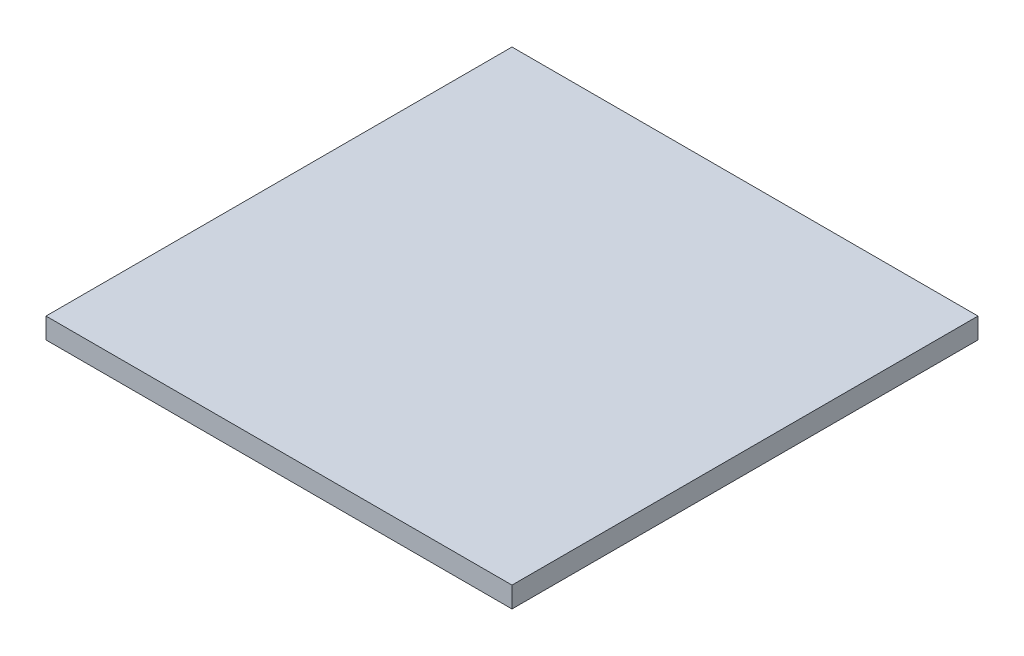
ISO-10303-21;
HEADER;
FILE_DESCRIPTION(('STEP AP214'),'2;1');
FILE_NAME('part.step','',(''),(''),'','','');
FILE_SCHEMA(('AUTOMOTIVE_DESIGN { 1 0 10303 214 1 1 1 1 }'));
ENDSEC;
DATA;
#1=APPLICATION_CONTEXT('core data for automotive mechanical design processes');
#2=APPLICATION_PROTOCOL_DEFINITION('international standard','automotive_design',2000,#1);
#3=PRODUCT_CONTEXT('',#1,'mechanical');
#4=PRODUCT('Part','Part','',(#3));
#5=PRODUCT_RELATED_PRODUCT_CATEGORY('part','',(#4));
#6=PRODUCT_DEFINITION_FORMATION('','',#4);
#7=PRODUCT_DEFINITION_CONTEXT('part definition',#1,'design');
#8=PRODUCT_DEFINITION('design','',#6,#7);
#9=PRODUCT_DEFINITION_SHAPE('','',#8);
#10=(LENGTH_UNIT() NAMED_UNIT(*) SI_UNIT(.MILLI.,.METRE.));
#11=(NAMED_UNIT(*) PLANE_ANGLE_UNIT() SI_UNIT($,.RADIAN.));
#12=(NAMED_UNIT(*) SI_UNIT($,.STERADIAN.) SOLID_ANGLE_UNIT());
#13=UNCERTAINTY_MEASURE_WITH_UNIT(LENGTH_MEASURE(1.E-05),#10,'distance_accuracy_value','');
#14=(GEOMETRIC_REPRESENTATION_CONTEXT(3) GLOBAL_UNCERTAINTY_ASSIGNED_CONTEXT((#13)) GLOBAL_UNIT_ASSIGNED_CONTEXT((#10,
#11,#12)) REPRESENTATION_CONTEXT('',''));
#15=CARTESIAN_POINT('',(0.,0.,0.));
#16=DIRECTION('',(0.,0.,1.));
#17=DIRECTION('',(1.,0.,0.));
#18=AXIS2_PLACEMENT_3D('',#15,#16,#17);
#19=CARTESIAN_POINT('',(0.,25.4,0.));
#20=DIRECTION('',(-1.,0.,0.));
#21=DIRECTION('',(0.,0.,1.));
#22=AXIS2_PLACEMENT_3D('',#19,#20,#21);
#23=PLANE('',#22);
#24=DIRECTION('',(0.,0.,-1.));
#25=VECTOR('',#24,1.);
#26=CARTESIAN_POINT('',(0.,0.,0.));
#27=LINE('',#26,#25);
#28=CARTESIAN_POINT('',(0.,0.,0.));
#29=VERTEX_POINT('',#28);
#30=CARTESIAN_POINT('',(0.,0.,-571.5));
#31=VERTEX_POINT('',#30);
#32=EDGE_CURVE('E96',#29,#31,#27,.T.);
#33=ORIENTED_EDGE('',*,*,#32,.T.);
#34=DIRECTION('',(0.,-1.,0.));
#35=VECTOR('',#34,1.);
#36=CARTESIAN_POINT('',(0.,25.4,-571.5));
#37=LINE('',#36,#35);
#38=CARTESIAN_POINT('',(0.,25.4,-571.5));
#39=VERTEX_POINT('',#38);
#40=EDGE_CURVE('E11',#39,#31,#37,.T.);
#41=ORIENTED_EDGE('',*,*,#40,.F.);
#42=DIRECTION('',(0.,0.,-1.));
#43=VECTOR('',#42,1.);
#44=CARTESIAN_POINT('',(0.,25.4,0.));
#45=LINE('',#44,#43);
#46=CARTESIAN_POINT('',(0.,25.4,0.));
#47=VERTEX_POINT('',#46);
#48=EDGE_CURVE('E84',#47,#39,#45,.T.);
#49=ORIENTED_EDGE('',*,*,#48,.F.);
#50=DIRECTION('',(0.,-1.,0.));
#51=VECTOR('',#50,1.);
#52=CARTESIAN_POINT('',(0.,25.4,0.));
#53=LINE('',#52,#51);
#54=EDGE_CURVE('E92',#47,#29,#53,.T.);
#55=ORIENTED_EDGE('',*,*,#54,.T.);
#56=EDGE_LOOP('',(#33,#41,#49,#55));
#57=FACE_BOUND('',#56,.T.);
#58=ADVANCED_FACE('F33',(#57),#23,.F.);
#59=CARTESIAN_POINT('',(0.,25.4,-571.5));
#60=DIRECTION('',(0.,0.,1.));
#61=DIRECTION('',(1.,0.,0.));
#62=AXIS2_PLACEMENT_3D('',#59,#60,#61);
#63=PLANE('',#62);
#64=DIRECTION('',(-1.,0.,0.));
#65=VECTOR('',#64,1.);
#66=CARTESIAN_POINT('',(0.,0.,-571.5));
#67=LINE('',#66,#65);
#68=CARTESIAN_POINT('',(-571.5,0.,-571.5));
#69=VERTEX_POINT('',#68);
#70=EDGE_CURVE('E88',#31,#69,#67,.T.);
#71=ORIENTED_EDGE('',*,*,#70,.T.);
#72=DIRECTION('',(0.,-1.,0.));
#73=VECTOR('',#72,1.);
#74=CARTESIAN_POINT('',(-571.5,25.4,-571.5));
#75=LINE('',#74,#73);
#76=CARTESIAN_POINT('',(-571.5,25.4,-571.5));
#77=VERTEX_POINT('',#76);
#78=EDGE_CURVE('E41',#77,#69,#75,.T.);
#79=ORIENTED_EDGE('',*,*,#78,.F.);
#80=DIRECTION('',(-1.,0.,0.));
#81=VECTOR('',#80,1.);
#82=CARTESIAN_POINT('',(0.,25.4,-571.5));
#83=LINE('',#82,#81);
#84=EDGE_CURVE('E79',#39,#77,#83,.T.);
#85=ORIENTED_EDGE('',*,*,#84,.F.);
#86=ORIENTED_EDGE('',*,*,#40,.T.);
#87=EDGE_LOOP('',(#71,#79,#85,#86));
#88=FACE_BOUND('',#87,.T.);
#89=ADVANCED_FACE('F87',(#88),#63,.F.);
#90=CARTESIAN_POINT('',(-571.5,25.4,0.));
#91=DIRECTION('',(1.,0.,0.));
#92=DIRECTION('',(0.,0.,-1.));
#93=AXIS2_PLACEMENT_3D('',#90,#91,#92);
#94=PLANE('',#93);
#95=DIRECTION('',(0.,0.,1.));
#96=VECTOR('',#95,1.);
#97=CARTESIAN_POINT('',(-571.5,0.,0.));
#98=LINE('',#97,#96);
#99=CARTESIAN_POINT('',(-571.5,0.,0.));
#100=VERTEX_POINT('',#99);
#101=EDGE_CURVE('E66',#69,#100,#98,.T.);
#102=ORIENTED_EDGE('',*,*,#101,.T.);
#103=DIRECTION('',(0.,-1.,0.));
#104=VECTOR('',#103,1.);
#105=CARTESIAN_POINT('',(-571.5,25.4,0.));
#106=LINE('',#105,#104);
#107=CARTESIAN_POINT('',(-571.5,25.4,0.));
#108=VERTEX_POINT('',#107);
#109=EDGE_CURVE('E89',#108,#100,#106,.T.);
#110=ORIENTED_EDGE('',*,*,#109,.F.);
#111=DIRECTION('',(0.,0.,1.));
#112=VECTOR('',#111,1.);
#113=CARTESIAN_POINT('',(-571.5,25.4,0.));
#114=LINE('',#113,#112);
#115=EDGE_CURVE('E82',#77,#108,#114,.T.);
#116=ORIENTED_EDGE('',*,*,#115,.F.);
#117=ORIENTED_EDGE('',*,*,#78,.T.);
#118=EDGE_LOOP('',(#102,#110,#116,#117));
#119=FACE_BOUND('',#118,.T.);
#120=ADVANCED_FACE('F90',(#119),#94,.F.);
#121=CARTESIAN_POINT('',(0.,25.4,0.));
#122=DIRECTION('',(0.,0.,-1.));
#123=DIRECTION('',(-1.,0.,0.));
#124=AXIS2_PLACEMENT_3D('',#121,#122,#123);
#125=PLANE('',#124);
#126=DIRECTION('',(1.,0.,0.));
#127=VECTOR('',#126,1.);
#128=CARTESIAN_POINT('',(0.,0.,0.));
#129=LINE('',#128,#127);
#130=EDGE_CURVE('E72',#100,#29,#129,.T.);
#131=ORIENTED_EDGE('',*,*,#130,.T.);
#132=ORIENTED_EDGE('',*,*,#54,.F.);
#133=DIRECTION('',(1.,0.,0.));
#134=VECTOR('',#133,1.);
#135=CARTESIAN_POINT('',(0.,25.4,0.));
#136=LINE('',#135,#134);
#137=EDGE_CURVE('E49',#108,#47,#136,.T.);
#138=ORIENTED_EDGE('',*,*,#137,.F.);
#139=ORIENTED_EDGE('',*,*,#109,.T.);
#140=EDGE_LOOP('',(#131,#132,#138,#139));
#141=FACE_BOUND('',#140,.T.);
#142=ADVANCED_FACE('F103',(#141),#125,.F.);
#143=CARTESIAN_POINT('',(0.,25.4,0.));
#144=DIRECTION('',(0.,1.,0.));
#145=DIRECTION('',(0.,0.,1.));
#146=AXIS2_PLACEMENT_3D('',#143,#144,#145);
#147=PLANE('',#146);
#148=ORIENTED_EDGE('',*,*,#48,.T.);
#149=ORIENTED_EDGE('',*,*,#84,.T.);
#150=ORIENTED_EDGE('',*,*,#115,.T.);
#151=ORIENTED_EDGE('',*,*,#137,.T.);
#152=EDGE_LOOP('',(#148,#149,#150,#151));
#153=FACE_BOUND('',#152,.T.);
#154=ADVANCED_FACE('F80',(#153),#147,.T.);
#155=CARTESIAN_POINT('',(0.,0.,0.));
#156=DIRECTION('',(0.,1.,0.));
#157=DIRECTION('',(0.,0.,1.));
#158=AXIS2_PLACEMENT_3D('',#155,#156,#157);
#159=PLANE('',#158);
#160=ORIENTED_EDGE('',*,*,#32,.F.);
#161=ORIENTED_EDGE('',*,*,#130,.F.);
#162=ORIENTED_EDGE('',*,*,#101,.F.);
#163=ORIENTED_EDGE('',*,*,#70,.F.);
#164=EDGE_LOOP('',(#160,#161,#162,#163));
#165=FACE_BOUND('',#164,.T.);
#166=ADVANCED_FACE('F106',(#165),#159,.F.);
#167=CLOSED_SHELL('',(#58,#89,#120,#142,#154,#166));
#168=MANIFOLD_SOLID_BREP('B2',#167);
#169=ADVANCED_BREP_SHAPE_REPRESENTATION('',(#18,#168),#14);
#170=SHAPE_DEFINITION_REPRESENTATION(#9,#169);
ENDSEC;
END-ISO-10303-21;
